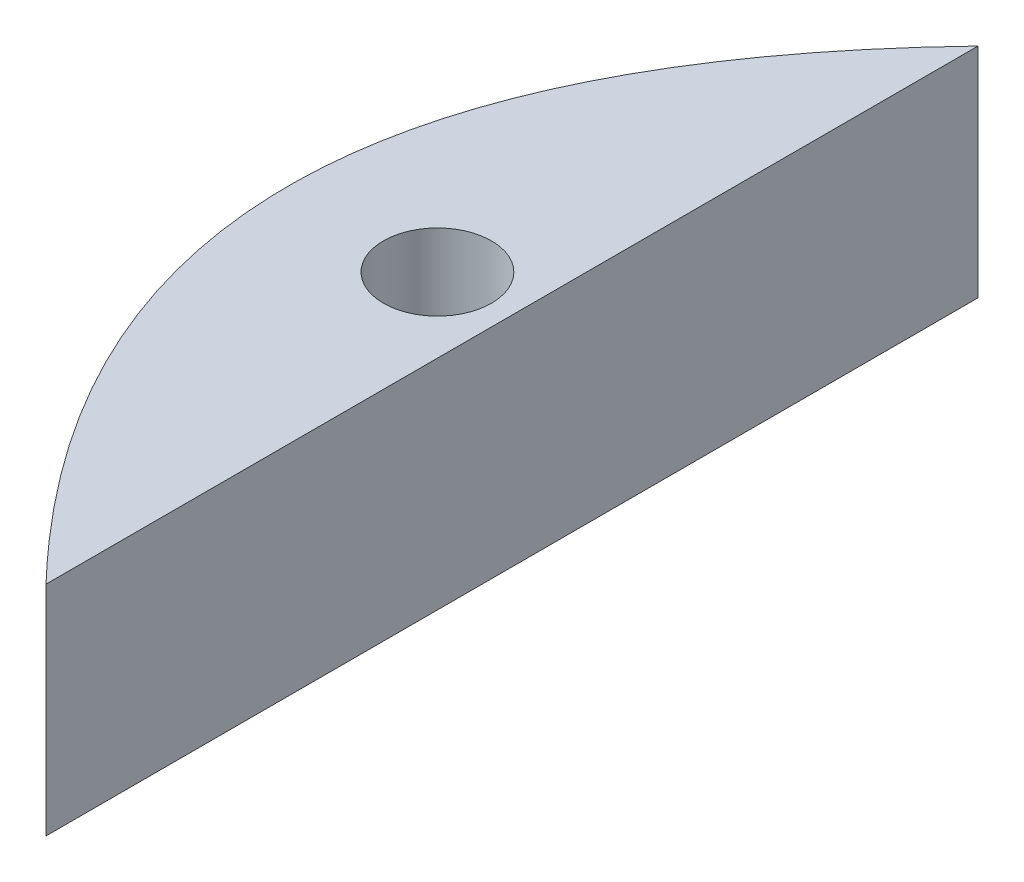
ISO-10303-21;
HEADER;
FILE_DESCRIPTION(('STEP AP214'),'2;1');
FILE_NAME('part.step','',(''),(''),'','','');
FILE_SCHEMA(('AUTOMOTIVE_DESIGN { 1 0 10303 214 1 1 1 1 }'));
ENDSEC;
DATA;
#1=APPLICATION_CONTEXT('core data for automotive mechanical design processes');
#2=APPLICATION_PROTOCOL_DEFINITION('international standard','automotive_design',2000,#1);
#3=PRODUCT_CONTEXT('',#1,'mechanical');
#4=PRODUCT('Part','Part','',(#3));
#5=PRODUCT_RELATED_PRODUCT_CATEGORY('part','',(#4));
#6=PRODUCT_DEFINITION_FORMATION('','',#4);
#7=PRODUCT_DEFINITION_CONTEXT('part definition',#1,'design');
#8=PRODUCT_DEFINITION('design','',#6,#7);
#9=PRODUCT_DEFINITION_SHAPE('','',#8);
#10=(LENGTH_UNIT() NAMED_UNIT(*) SI_UNIT(.MILLI.,.METRE.));
#11=(NAMED_UNIT(*) PLANE_ANGLE_UNIT() SI_UNIT($,.RADIAN.));
#12=(NAMED_UNIT(*) SI_UNIT($,.STERADIAN.) SOLID_ANGLE_UNIT());
#13=UNCERTAINTY_MEASURE_WITH_UNIT(LENGTH_MEASURE(1.E-05),#10,'distance_accuracy_value','');
#14=(GEOMETRIC_REPRESENTATION_CONTEXT(3) GLOBAL_UNCERTAINTY_ASSIGNED_CONTEXT((#13)) GLOBAL_UNIT_ASSIGNED_CONTEXT((#10,
#11,#12)) REPRESENTATION_CONTEXT('',''));
#15=CARTESIAN_POINT('',(0.,0.,0.));
#16=DIRECTION('',(0.,0.,1.));
#17=DIRECTION('',(1.,0.,0.));
#18=AXIS2_PLACEMENT_3D('',#15,#16,#17);
#19=CARTESIAN_POINT('',(-4.,5.85,0.));
#20=DIRECTION('',(0.,-1.,0.));
#21=DIRECTION('',(0.,0.,-1.));
#22=AXIS2_PLACEMENT_3D('',#19,#20,#21);
#23=PLANE('',#22);
#24=CARTESIAN_POINT('',(2.,5.85,-12.5));
#25=CARTESIAN_POINT('',(-10.,5.85,0.));
#26=CARTESIAN_POINT('',(2.,5.85,12.5));
#27=B_SPLINE_CURVE_WITH_KNOTS('',2,(#24,#25,#26),.UNSPECIFIED.,.F.,.F.,(3,3),(0.,1.),.UNSPECIFIED.);
#28=CARTESIAN_POINT('',(2.,5.85,-12.5));
#29=VERTEX_POINT('',#28);
#30=CARTESIAN_POINT('',(2.,5.85,12.5));
#31=VERTEX_POINT('',#30);
#32=EDGE_CURVE('E64',#29,#31,#27,.T.);
#33=ORIENTED_EDGE('',*,*,#32,.T.);
#34=DIRECTION('',(0.,0.,-1.));
#35=VECTOR('',#34,1.);
#36=CARTESIAN_POINT('',(2.,5.85,-12.5));
#37=LINE('',#36,#35);
#38=EDGE_CURVE('E49',#31,#29,#37,.T.);
#39=ORIENTED_EDGE('',*,*,#38,.T.);
#40=EDGE_LOOP('',(#33,#39));
#41=FACE_BOUND('',#40,.T.);
#42=CARTESIAN_POINT('',(0.,5.85,0.));
#43=DIRECTION('',(0.,1.,0.));
#44=DIRECTION('',(0.,0.,1.));
#45=AXIS2_PLACEMENT_3D('',#42,#43,#44);
#46=CIRCLE('',#45,1.45);
#47=CARTESIAN_POINT('',(0.,5.85,1.45));
#48=VERTEX_POINT('',#47);
#49=EDGE_CURVE('E70',#48,#48,#46,.T.);
#50=ORIENTED_EDGE('',*,*,#49,.F.);
#51=EDGE_LOOP('',(#50));
#52=FACE_BOUND('',#51,.T.);
#53=ADVANCED_FACE('F32',(#41,#52),#23,.F.);
#54=CARTESIAN_POINT('',(-4.,0.,0.));
#55=DIRECTION('',(0.,-1.,0.));
#56=DIRECTION('',(0.,0.,-1.));
#57=AXIS2_PLACEMENT_3D('',#54,#55,#56);
#58=PLANE('',#57);
#59=CARTESIAN_POINT('',(2.,0.,-12.5));
#60=CARTESIAN_POINT('',(-10.,0.,0.));
#61=CARTESIAN_POINT('',(2.,0.,12.5));
#62=B_SPLINE_CURVE_WITH_KNOTS('',2,(#59,#60,#61),.UNSPECIFIED.,.F.,.F.,(3,3),(0.,1.),.UNSPECIFIED.);
#63=CARTESIAN_POINT('',(2.,0.,-12.5));
#64=VERTEX_POINT('',#63);
#65=CARTESIAN_POINT('',(2.,0.,12.5));
#66=VERTEX_POINT('',#65);
#67=EDGE_CURVE('E65',#64,#66,#62,.T.);
#68=ORIENTED_EDGE('',*,*,#67,.F.);
#69=DIRECTION('',(0.,0.,-1.));
#70=VECTOR('',#69,1.);
#71=CARTESIAN_POINT('',(2.,0.,-12.5));
#72=LINE('',#71,#70);
#73=EDGE_CURVE('E57',#66,#64,#72,.T.);
#74=ORIENTED_EDGE('',*,*,#73,.F.);
#75=EDGE_LOOP('',(#68,#74));
#76=FACE_BOUND('',#75,.T.);
#77=CARTESIAN_POINT('',(0.,0.,0.));
#78=DIRECTION('',(0.,1.,0.));
#79=DIRECTION('',(0.,0.,1.));
#80=AXIS2_PLACEMENT_3D('',#77,#78,#79);
#81=CIRCLE('',#80,1.45);
#82=CARTESIAN_POINT('',(0.,0.,1.45));
#83=VERTEX_POINT('',#82);
#84=EDGE_CURVE('E73',#83,#83,#81,.T.);
#85=ORIENTED_EDGE('',*,*,#84,.T.);
#86=EDGE_LOOP('',(#85));
#87=FACE_BOUND('',#86,.T.);
#88=ADVANCED_FACE('F68',(#76,#87),#58,.T.);
#89=DIRECTION('',(0.,-1.,0.));
#90=VECTOR('',#89,1.);
#91=SURFACE_OF_LINEAR_EXTRUSION('',#27,#90);
#92=ORIENTED_EDGE('',*,*,#67,.T.);
#93=DIRECTION('',(0.,-1.,0.));
#94=VECTOR('',#93,1.);
#95=CARTESIAN_POINT('',(2.,5.85,12.5));
#96=LINE('',#95,#94);
#97=EDGE_CURVE('E11',#31,#66,#96,.T.);
#98=ORIENTED_EDGE('',*,*,#97,.F.);
#99=ORIENTED_EDGE('',*,*,#32,.F.);
#100=DIRECTION('',(0.,-1.,0.));
#101=VECTOR('',#100,1.);
#102=CARTESIAN_POINT('',(2.,5.85,-12.5));
#103=LINE('',#102,#101);
#104=EDGE_CURVE('E42',#29,#64,#103,.T.);
#105=ORIENTED_EDGE('',*,*,#104,.T.);
#106=EDGE_LOOP('',(#92,#98,#99,#105));
#107=FACE_BOUND('',#106,.T.);
#108=ADVANCED_FACE('F34',(#107),#91,.F.);
#109=CARTESIAN_POINT('',(2.,5.85,-12.5));
#110=DIRECTION('',(-1.,0.,0.));
#111=DIRECTION('',(0.,0.,1.));
#112=AXIS2_PLACEMENT_3D('',#109,#110,#111);
#113=PLANE('',#112);
#114=ORIENTED_EDGE('',*,*,#73,.T.);
#115=ORIENTED_EDGE('',*,*,#104,.F.);
#116=ORIENTED_EDGE('',*,*,#38,.F.);
#117=ORIENTED_EDGE('',*,*,#97,.T.);
#118=EDGE_LOOP('',(#114,#115,#116,#117));
#119=FACE_BOUND('',#118,.T.);
#120=ADVANCED_FACE('F60',(#119),#113,.F.);
#121=CARTESIAN_POINT('',(0.,5.85,0.));
#122=DIRECTION('',(0.,-1.,0.));
#123=DIRECTION('',(0.,0.,-1.));
#124=AXIS2_PLACEMENT_3D('',#121,#122,#123);
#125=CYLINDRICAL_SURFACE('',#124,1.45);
#126=ORIENTED_EDGE('',*,*,#49,.T.);
#127=EDGE_LOOP('',(#126));
#128=FACE_BOUND('',#127,.T.);
#129=ORIENTED_EDGE('',*,*,#84,.F.);
#130=EDGE_LOOP('',(#129));
#131=FACE_BOUND('',#130,.T.);
#132=ADVANCED_FACE('F91',(#128,#131),#125,.F.);
#133=CLOSED_SHELL('',(#53,#88,#108,#120,#132));
#134=MANIFOLD_SOLID_BREP('B2',#133);
#135=ADVANCED_BREP_SHAPE_REPRESENTATION('',(#18,#134),#14);
#136=SHAPE_DEFINITION_REPRESENTATION(#9,#135);
ENDSEC;
END-ISO-10303-21;
